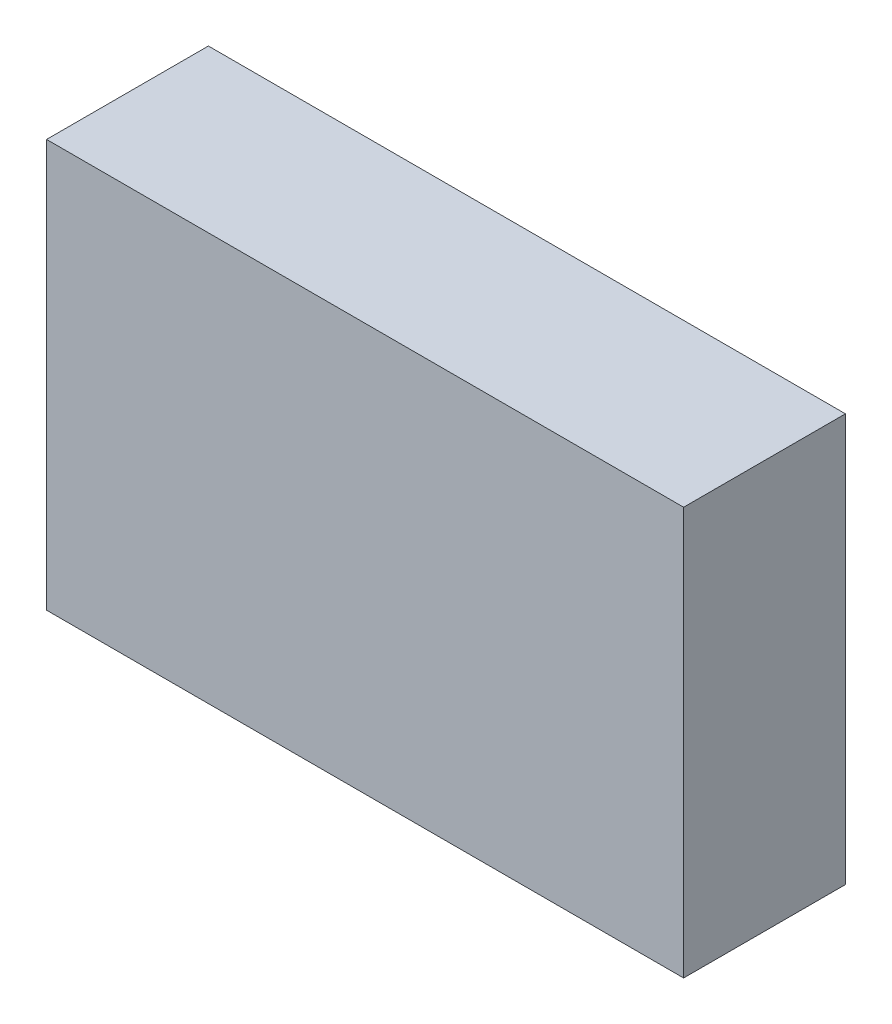
ISO-10303-21;
HEADER;
FILE_DESCRIPTION(('STEP AP214'),'2;1');
FILE_NAME('part.step','',(''),(''),'','','');
FILE_SCHEMA(('AUTOMOTIVE_DESIGN { 1 0 10303 214 1 1 1 1 }'));
ENDSEC;
DATA;
#1=APPLICATION_CONTEXT('core data for automotive mechanical design processes');
#2=APPLICATION_PROTOCOL_DEFINITION('international standard','automotive_design',2000,#1);
#3=PRODUCT_CONTEXT('',#1,'mechanical');
#4=PRODUCT('Part','Part','',(#3));
#5=PRODUCT_RELATED_PRODUCT_CATEGORY('part','',(#4));
#6=PRODUCT_DEFINITION_FORMATION('','',#4);
#7=PRODUCT_DEFINITION_CONTEXT('part definition',#1,'design');
#8=PRODUCT_DEFINITION('design','',#6,#7);
#9=PRODUCT_DEFINITION_SHAPE('','',#8);
#10=(LENGTH_UNIT() NAMED_UNIT(*) SI_UNIT(.MILLI.,.METRE.));
#11=(NAMED_UNIT(*) PLANE_ANGLE_UNIT() SI_UNIT($,.RADIAN.));
#12=(NAMED_UNIT(*) SI_UNIT($,.STERADIAN.) SOLID_ANGLE_UNIT());
#13=UNCERTAINTY_MEASURE_WITH_UNIT(LENGTH_MEASURE(1.E-05),#10,'distance_accuracy_value','');
#14=(GEOMETRIC_REPRESENTATION_CONTEXT(3) GLOBAL_UNCERTAINTY_ASSIGNED_CONTEXT((#13)) GLOBAL_UNIT_ASSIGNED_CONTEXT((#10,
#11,#12)) REPRESENTATION_CONTEXT('',''));
#15=CARTESIAN_POINT('',(0.,0.,0.));
#16=DIRECTION('',(0.,0.,1.));
#17=DIRECTION('',(1.,0.,0.));
#18=AXIS2_PLACEMENT_3D('',#15,#16,#17);
#19=CARTESIAN_POINT('',(-25.,-16.,12.7));
#20=DIRECTION('',(1.,0.,0.));
#21=DIRECTION('',(0.,0.,-1.));
#22=AXIS2_PLACEMENT_3D('',#19,#20,#21);
#23=PLANE('',#22);
#24=DIRECTION('',(0.,-1.,0.));
#25=VECTOR('',#24,1.);
#26=CARTESIAN_POINT('',(-25.,-16.,0.));
#27=LINE('',#26,#25);
#28=CARTESIAN_POINT('',(-25.,16.,0.));
#29=VERTEX_POINT('',#28);
#30=CARTESIAN_POINT('',(-25.,-16.,0.));
#31=VERTEX_POINT('',#30);
#32=EDGE_CURVE('E96',#29,#31,#27,.T.);
#33=ORIENTED_EDGE('',*,*,#32,.T.);
#34=DIRECTION('',(0.,0.,-1.));
#35=VECTOR('',#34,1.);
#36=CARTESIAN_POINT('',(-25.,-16.,12.7));
#37=LINE('',#36,#35);
#38=CARTESIAN_POINT('',(-25.,-16.,12.7));
#39=VERTEX_POINT('',#38);
#40=EDGE_CURVE('E11',#39,#31,#37,.T.);
#41=ORIENTED_EDGE('',*,*,#40,.F.);
#42=DIRECTION('',(0.,-1.,0.));
#43=VECTOR('',#42,1.);
#44=CARTESIAN_POINT('',(-25.,-16.,12.7));
#45=LINE('',#44,#43);
#46=CARTESIAN_POINT('',(-25.,16.,12.7));
#47=VERTEX_POINT('',#46);
#48=EDGE_CURVE('E84',#47,#39,#45,.T.);
#49=ORIENTED_EDGE('',*,*,#48,.F.);
#50=DIRECTION('',(0.,0.,-1.));
#51=VECTOR('',#50,1.);
#52=CARTESIAN_POINT('',(-25.,16.,12.7));
#53=LINE('',#52,#51);
#54=EDGE_CURVE('E92',#47,#29,#53,.T.);
#55=ORIENTED_EDGE('',*,*,#54,.T.);
#56=EDGE_LOOP('',(#33,#41,#49,#55));
#57=FACE_BOUND('',#56,.T.);
#58=ADVANCED_FACE('F33',(#57),#23,.F.);
#59=CARTESIAN_POINT('',(25.,-16.,12.7));
#60=DIRECTION('',(0.,1.,0.));
#61=DIRECTION('',(-1.,0.,0.));
#62=AXIS2_PLACEMENT_3D('',#59,#60,#61);
#63=PLANE('',#62);
#64=DIRECTION('',(1.,0.,0.));
#65=VECTOR('',#64,1.);
#66=CARTESIAN_POINT('',(25.,-16.,0.));
#67=LINE('',#66,#65);
#68=CARTESIAN_POINT('',(25.,-16.,0.));
#69=VERTEX_POINT('',#68);
#70=EDGE_CURVE('E88',#31,#69,#67,.T.);
#71=ORIENTED_EDGE('',*,*,#70,.T.);
#72=DIRECTION('',(0.,0.,-1.));
#73=VECTOR('',#72,1.);
#74=CARTESIAN_POINT('',(25.,-16.,12.7));
#75=LINE('',#74,#73);
#76=CARTESIAN_POINT('',(25.,-16.,12.7));
#77=VERTEX_POINT('',#76);
#78=EDGE_CURVE('E41',#77,#69,#75,.T.);
#79=ORIENTED_EDGE('',*,*,#78,.F.);
#80=DIRECTION('',(1.,0.,0.));
#81=VECTOR('',#80,1.);
#82=CARTESIAN_POINT('',(25.,-16.,12.7));
#83=LINE('',#82,#81);
#84=EDGE_CURVE('E79',#39,#77,#83,.T.);
#85=ORIENTED_EDGE('',*,*,#84,.F.);
#86=ORIENTED_EDGE('',*,*,#40,.T.);
#87=EDGE_LOOP('',(#71,#79,#85,#86));
#88=FACE_BOUND('',#87,.T.);
#89=ADVANCED_FACE('F87',(#88),#63,.F.);
#90=CARTESIAN_POINT('',(25.,-16.,12.7));
#91=DIRECTION('',(-1.,0.,0.));
#92=DIRECTION('',(0.,0.,1.));
#93=AXIS2_PLACEMENT_3D('',#90,#91,#92);
#94=PLANE('',#93);
#95=DIRECTION('',(0.,1.,0.));
#96=VECTOR('',#95,1.);
#97=CARTESIAN_POINT('',(25.,-16.,0.));
#98=LINE('',#97,#96);
#99=CARTESIAN_POINT('',(25.,16.,0.));
#100=VERTEX_POINT('',#99);
#101=EDGE_CURVE('E66',#69,#100,#98,.T.);
#102=ORIENTED_EDGE('',*,*,#101,.T.);
#103=DIRECTION('',(0.,0.,-1.));
#104=VECTOR('',#103,1.);
#105=CARTESIAN_POINT('',(25.,16.,12.7));
#106=LINE('',#105,#104);
#107=CARTESIAN_POINT('',(25.,16.,12.7));
#108=VERTEX_POINT('',#107);
#109=EDGE_CURVE('E89',#108,#100,#106,.T.);
#110=ORIENTED_EDGE('',*,*,#109,.F.);
#111=DIRECTION('',(0.,1.,0.));
#112=VECTOR('',#111,1.);
#113=CARTESIAN_POINT('',(25.,-16.,12.7));
#114=LINE('',#113,#112);
#115=EDGE_CURVE('E82',#77,#108,#114,.T.);
#116=ORIENTED_EDGE('',*,*,#115,.F.);
#117=ORIENTED_EDGE('',*,*,#78,.T.);
#118=EDGE_LOOP('',(#102,#110,#116,#117));
#119=FACE_BOUND('',#118,.T.);
#120=ADVANCED_FACE('F90',(#119),#94,.F.);
#121=CARTESIAN_POINT('',(25.,16.,12.7));
#122=DIRECTION('',(0.,-1.,0.));
#123=DIRECTION('',(1.,0.,0.));
#124=AXIS2_PLACEMENT_3D('',#121,#122,#123);
#125=PLANE('',#124);
#126=DIRECTION('',(-1.,0.,0.));
#127=VECTOR('',#126,1.);
#128=CARTESIAN_POINT('',(25.,16.,0.));
#129=LINE('',#128,#127);
#130=EDGE_CURVE('E72',#100,#29,#129,.T.);
#131=ORIENTED_EDGE('',*,*,#130,.T.);
#132=ORIENTED_EDGE('',*,*,#54,.F.);
#133=DIRECTION('',(-1.,0.,0.));
#134=VECTOR('',#133,1.);
#135=CARTESIAN_POINT('',(25.,16.,12.7));
#136=LINE('',#135,#134);
#137=EDGE_CURVE('E49',#108,#47,#136,.T.);
#138=ORIENTED_EDGE('',*,*,#137,.F.);
#139=ORIENTED_EDGE('',*,*,#109,.T.);
#140=EDGE_LOOP('',(#131,#132,#138,#139));
#141=FACE_BOUND('',#140,.T.);
#142=ADVANCED_FACE('F103',(#141),#125,.F.);
#143=CARTESIAN_POINT('',(0.,0.,12.7));
#144=DIRECTION('',(0.,0.,1.));
#145=DIRECTION('',(1.,0.,0.));
#146=AXIS2_PLACEMENT_3D('',#143,#144,#145);
#147=PLANE('',#146);
#148=ORIENTED_EDGE('',*,*,#48,.T.);
#149=ORIENTED_EDGE('',*,*,#84,.T.);
#150=ORIENTED_EDGE('',*,*,#115,.T.);
#151=ORIENTED_EDGE('',*,*,#137,.T.);
#152=EDGE_LOOP('',(#148,#149,#150,#151));
#153=FACE_BOUND('',#152,.T.);
#154=ADVANCED_FACE('F80',(#153),#147,.T.);
#155=CARTESIAN_POINT('',(0.,0.,0.));
#156=DIRECTION('',(0.,0.,1.));
#157=DIRECTION('',(1.,0.,0.));
#158=AXIS2_PLACEMENT_3D('',#155,#156,#157);
#159=PLANE('',#158);
#160=ORIENTED_EDGE('',*,*,#32,.F.);
#161=ORIENTED_EDGE('',*,*,#130,.F.);
#162=ORIENTED_EDGE('',*,*,#101,.F.);
#163=ORIENTED_EDGE('',*,*,#70,.F.);
#164=EDGE_LOOP('',(#160,#161,#162,#163));
#165=FACE_BOUND('',#164,.T.);
#166=ADVANCED_FACE('F106',(#165),#159,.F.);
#167=CLOSED_SHELL('',(#58,#89,#120,#142,#154,#166));
#168=MANIFOLD_SOLID_BREP('B2',#167);
#169=ADVANCED_BREP_SHAPE_REPRESENTATION('',(#18,#168),#14);
#170=SHAPE_DEFINITION_REPRESENTATION(#9,#169);
ENDSEC;
END-ISO-10303-21;
